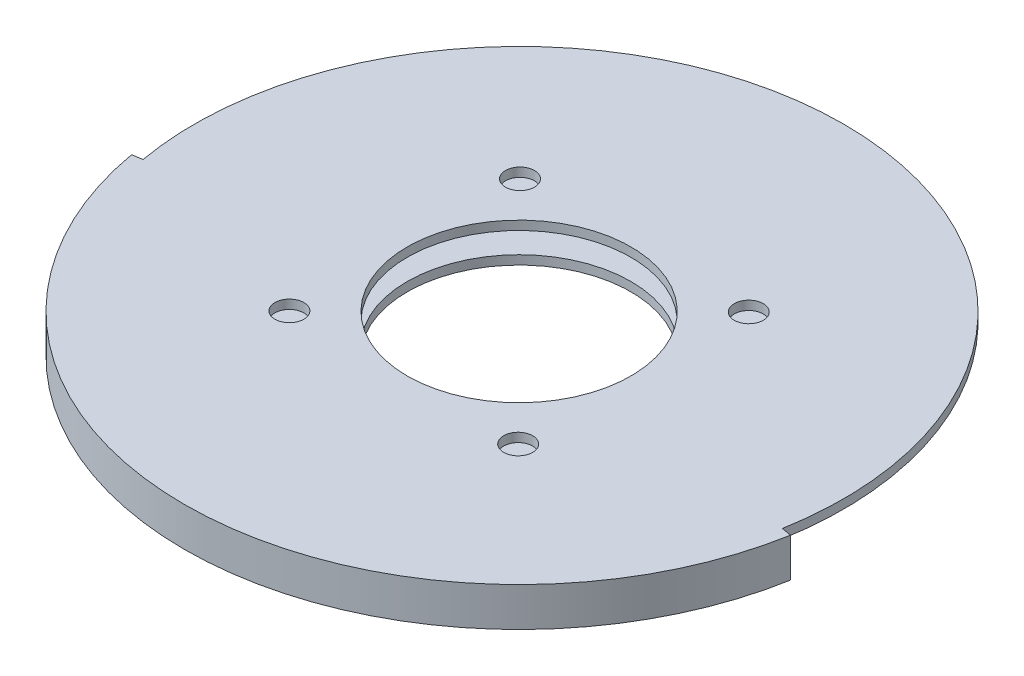
ISO-10303-21;
HEADER;
FILE_DESCRIPTION(('STEP AP214'),'2;1');
FILE_NAME('part.step','',(''),(''),'','','');
FILE_SCHEMA(('AUTOMOTIVE_DESIGN { 1 0 10303 214 1 1 1 1 }'));
ENDSEC;
DATA;
#1=APPLICATION_CONTEXT('core data for automotive mechanical design processes');
#2=APPLICATION_PROTOCOL_DEFINITION('international standard','automotive_design',2000,#1);
#3=PRODUCT_CONTEXT('',#1,'mechanical');
#4=PRODUCT('Part','Part','',(#3));
#5=PRODUCT_RELATED_PRODUCT_CATEGORY('part','',(#4));
#6=PRODUCT_DEFINITION_FORMATION('','',#4);
#7=PRODUCT_DEFINITION_CONTEXT('part definition',#1,'design');
#8=PRODUCT_DEFINITION('design','',#6,#7);
#9=PRODUCT_DEFINITION_SHAPE('','',#8);
#10=(LENGTH_UNIT() NAMED_UNIT(*) SI_UNIT(.MILLI.,.METRE.));
#11=(NAMED_UNIT(*) PLANE_ANGLE_UNIT() SI_UNIT($,.RADIAN.));
#12=(NAMED_UNIT(*) SI_UNIT($,.STERADIAN.) SOLID_ANGLE_UNIT());
#13=UNCERTAINTY_MEASURE_WITH_UNIT(LENGTH_MEASURE(1.E-05),#10,'distance_accuracy_value','');
#14=(GEOMETRIC_REPRESENTATION_CONTEXT(3) GLOBAL_UNCERTAINTY_ASSIGNED_CONTEXT((#13)) GLOBAL_UNIT_ASSIGNED_CONTEXT((#10,
#11,#12)) REPRESENTATION_CONTEXT('',''));
#15=CARTESIAN_POINT('',(0.,0.,0.));
#16=DIRECTION('',(0.,0.,1.));
#17=DIRECTION('',(1.,0.,0.));
#18=AXIS2_PLACEMENT_3D('',#15,#16,#17);
#19=CARTESIAN_POINT('',(0.,474.404389454863,0.));
#20=DIRECTION('',(0.,1.,0.));
#21=DIRECTION('',(0.,0.,1.));
#22=AXIS2_PLACEMENT_3D('',#19,#20,#21);
#23=CYLINDRICAL_SURFACE('',#22,32.5);
#24=CARTESIAN_POINT('',(0.,475.304389454863,0.));
#25=DIRECTION('',(0.,-1.,0.));
#26=DIRECTION('',(0.,0.,-1.));
#27=AXIS2_PLACEMENT_3D('',#24,#25,#26);
#28=CIRCLE('',#27,32.5);
#29=CARTESIAN_POINT('',(32.0062519728968,475.304389454863,5.64356577417526));
#30=VERTEX_POINT('',#29);
#31=CARTESIAN_POINT('',(-32.0062519728968,475.304389454863,5.64356577417501));
#32=VERTEX_POINT('',#31);
#33=EDGE_CURVE('E109',#30,#32,#28,.T.);
#34=ORIENTED_EDGE('',*,*,#33,.T.);
#35=DIRECTION('',(0.,1.,0.));
#36=VECTOR('',#35,1.);
#37=CARTESIAN_POINT('',(-32.0062519728968,474.404389454863,5.643565774175));
#38=LINE('',#37,#36);
#39=CARTESIAN_POINT('',(-32.0062519728968,477.404389454863,5.643565774175));
#40=VERTEX_POINT('',#39);
#41=EDGE_CURVE('E148',#32,#40,#38,.T.);
#42=ORIENTED_EDGE('',*,*,#41,.T.);
#43=CARTESIAN_POINT('',(0.,477.404389454863,0.));
#44=DIRECTION('',(0.,1.,0.));
#45=DIRECTION('',(0.,0.,1.));
#46=AXIS2_PLACEMENT_3D('',#43,#44,#45);
#47=CIRCLE('',#46,32.5);
#48=CARTESIAN_POINT('',(32.0062519728968,477.404389454863,5.64356577417523));
#49=VERTEX_POINT('',#48);
#50=EDGE_CURVE('E147',#40,#49,#47,.T.);
#51=ORIENTED_EDGE('',*,*,#50,.T.);
#52=DIRECTION('',(0.,1.,0.));
#53=VECTOR('',#52,1.);
#54=CARTESIAN_POINT('',(32.0062519728968,474.404389454863,5.64356577417523));
#55=LINE('',#54,#53);
#56=EDGE_CURVE('E150',#30,#49,#55,.T.);
#57=ORIENTED_EDGE('',*,*,#56,.F.);
#58=EDGE_LOOP('',(#34,#42,#51,#57));
#59=FACE_BOUND('',#58,.T.);
#60=ADVANCED_FACE('F41',(#59),#23,.F.);
#61=CARTESIAN_POINT('',(0.,478.304389454863,0.));
#62=DIRECTION('',(0.,-1.,0.));
#63=DIRECTION('',(0.,0.,-1.));
#64=AXIS2_PLACEMENT_3D('',#61,#62,#63);
#65=CYLINDRICAL_SURFACE('',#64,32.5);
#66=CARTESIAN_POINT('',(-32.0062519728968,478.304389454863,5.643565774175));
#67=VERTEX_POINT('',#66);
#68=EDGE_CURVE('E58',#40,#67,#38,.T.);
#69=ORIENTED_EDGE('',*,*,#68,.T.);
#70=CARTESIAN_POINT('',(0.,478.304389454863,0.));
#71=DIRECTION('',(0.,1.,0.));
#72=DIRECTION('',(0.,0.,1.));
#73=AXIS2_PLACEMENT_3D('',#70,#71,#72);
#74=CIRCLE('',#73,32.5);
#75=CARTESIAN_POINT('',(32.0062519728968,478.304389454863,5.64356577417523));
#76=VERTEX_POINT('',#75);
#77=EDGE_CURVE('E11',#76,#67,#74,.T.);
#78=ORIENTED_EDGE('',*,*,#77,.F.);
#79=EDGE_CURVE('E152',#49,#76,#55,.T.);
#80=ORIENTED_EDGE('',*,*,#79,.F.);
#81=EDGE_CURVE('E50',#49,#40,#47,.T.);
#82=ORIENTED_EDGE('',*,*,#81,.T.);
#83=EDGE_LOOP('',(#69,#78,#80,#82));
#84=FACE_BOUND('',#83,.T.);
#85=ADVANCED_FACE('F43',(#84),#65,.T.);
#86=CARTESIAN_POINT('',(0.,478.304389454863,0.));
#87=DIRECTION('',(0.,1.,0.));
#88=DIRECTION('',(0.,0.,1.));
#89=AXIS2_PLACEMENT_3D('',#86,#87,#88);
#90=PLANE('',#89);
#91=CARTESIAN_POINT('',(11.4540717303614,478.304389454863,11.5457455712368));
#92=DIRECTION('',(0.,1.,0.));
#93=DIRECTION('',(0.,0.,1.));
#94=AXIS2_PLACEMENT_3D('',#91,#92,#93);
#95=CIRCLE('',#94,1.45);
#96=CARTESIAN_POINT('',(11.4540717303614,478.304389454863,12.9957455712368));
#97=VERTEX_POINT('',#96);
#98=EDGE_CURVE('E403',#97,#97,#95,.T.);
#99=ORIENTED_EDGE('',*,*,#98,.F.);
#100=EDGE_LOOP('',(#99));
#101=FACE_BOUND('',#100,.T.);
#102=CARTESIAN_POINT('',(-11.5457455712368,478.304389454863,11.4540717303614));
#103=DIRECTION('',(0.,1.,0.));
#104=DIRECTION('',(0.,0.,1.));
#105=AXIS2_PLACEMENT_3D('',#102,#103,#104);
#106=CIRCLE('',#105,1.45);
#107=CARTESIAN_POINT('',(-11.5457455712368,478.304389454863,12.9040717303614));
#108=VERTEX_POINT('',#107);
#109=EDGE_CURVE('E411',#108,#108,#106,.T.);
#110=ORIENTED_EDGE('',*,*,#109,.F.);
#111=EDGE_LOOP('',(#110));
#112=FACE_BOUND('',#111,.T.);
#113=CARTESIAN_POINT('',(0.,478.304389454863,0.));
#114=DIRECTION('',(0.,1.,0.));
#115=DIRECTION('',(0.,0.,1.));
#116=AXIS2_PLACEMENT_3D('',#113,#114,#115);
#117=CIRCLE('',#116,11.2);
#118=CARTESIAN_POINT('',(0.,478.304389454863,11.2));
#119=VERTEX_POINT('',#118);
#120=EDGE_CURVE('E439',#119,#119,#117,.T.);
#121=ORIENTED_EDGE('',*,*,#120,.F.);
#122=EDGE_LOOP('',(#121));
#123=FACE_BOUND('',#122,.T.);
#124=CARTESIAN_POINT('',(-11.4540717303614,478.304389454863,-11.5457455712369));
#125=DIRECTION('',(0.,1.,0.));
#126=DIRECTION('',(0.,0.,1.));
#127=AXIS2_PLACEMENT_3D('',#124,#125,#126);
#128=CIRCLE('',#127,1.45);
#129=CARTESIAN_POINT('',(-11.4540717303614,478.304389454863,-10.0957455712369));
#130=VERTEX_POINT('',#129);
#131=EDGE_CURVE('E422',#130,#130,#128,.T.);
#132=ORIENTED_EDGE('',*,*,#131,.F.);
#133=EDGE_LOOP('',(#132));
#134=FACE_BOUND('',#133,.T.);
#135=CARTESIAN_POINT('',(11.5457455712369,478.304389454863,-11.4540717303614));
#136=DIRECTION('',(0.,1.,0.));
#137=DIRECTION('',(0.,0.,1.));
#138=AXIS2_PLACEMENT_3D('',#135,#136,#137);
#139=CIRCLE('',#138,1.45);
#140=CARTESIAN_POINT('',(11.5457455712369,478.304389454863,-10.0040717303614));
#141=VERTEX_POINT('',#140);
#142=EDGE_CURVE('E405',#141,#141,#139,.T.);
#143=ORIENTED_EDGE('',*,*,#142,.F.);
#144=EDGE_LOOP('',(#143));
#145=FACE_BOUND('',#144,.T.);
#146=ORIENTED_EDGE('',*,*,#77,.T.);
#147=DIRECTION('',(0.984807753012212,0.,-0.17364817766691));
#148=VECTOR('',#147,1.);
#149=CARTESIAN_POINT('',(-32.991059725909,478.304389454863,5.81721395184191));
#150=LINE('',#149,#148);
#151=CARTESIAN_POINT('',(-32.991059725909,478.304389454863,5.81721395184191));
#152=VERTEX_POINT('',#151);
#153=EDGE_CURVE('E136',#152,#67,#150,.T.);
#154=ORIENTED_EDGE('',*,*,#153,.F.);
#155=CARTESIAN_POINT('',(0.,478.304389454863,0.));
#156=DIRECTION('',(0.,1.,0.));
#157=DIRECTION('',(1.,0.,0.));
#158=AXIS2_PLACEMENT_3D('',#155,#156,#157);
#159=CIRCLE('',#158,33.5);
#160=CARTESIAN_POINT('',(32.991059725909,478.304389454863,5.81721395184217));
#161=VERTEX_POINT('',#160);
#162=EDGE_CURVE('E125',#152,#161,#159,.T.);
#163=ORIENTED_EDGE('',*,*,#162,.T.);
#164=DIRECTION('',(0.984807753012207,0.,0.173648177666936));
#165=VECTOR('',#164,1.);
#166=CARTESIAN_POINT('',(32.0062519728968,478.304389454863,5.64356577417523));
#167=LINE('',#166,#165);
#168=EDGE_CURVE('E128',#76,#161,#167,.T.);
#169=ORIENTED_EDGE('',*,*,#168,.F.);
#170=EDGE_LOOP('',(#146,#154,#163,#169));
#171=FACE_BOUND('',#170,.T.);
#172=ADVANCED_FACE('F195',(#101,#112,#123,#134,#145,#171),#90,.T.);
#173=CARTESIAN_POINT('',(0.,477.404389454863,0.));
#174=DIRECTION('',(0.,1.,0.));
#175=DIRECTION('',(0.,0.,1.));
#176=AXIS2_PLACEMENT_3D('',#173,#174,#175);
#177=PLANE('',#176);
#178=CARTESIAN_POINT('',(11.4540717303614,477.404389454863,11.5457455712368));
#179=DIRECTION('',(0.,1.,0.));
#180=DIRECTION('',(0.,0.,1.));
#181=AXIS2_PLACEMENT_3D('',#178,#179,#180);
#182=CIRCLE('',#181,1.45);
#183=CARTESIAN_POINT('',(11.4540717303614,477.404389454863,12.9957455712368));
#184=VERTEX_POINT('',#183);
#185=EDGE_CURVE('E181',#184,#184,#182,.T.);
#186=ORIENTED_EDGE('',*,*,#185,.T.);
#187=EDGE_LOOP('',(#186));
#188=FACE_BOUND('',#187,.T.);
#189=CARTESIAN_POINT('',(-11.5457455712368,477.404389454863,11.4540717303614));
#190=DIRECTION('',(0.,1.,0.));
#191=DIRECTION('',(0.,0.,1.));
#192=AXIS2_PLACEMENT_3D('',#189,#190,#191);
#193=CIRCLE('',#192,1.45);
#194=CARTESIAN_POINT('',(-11.5457455712368,477.404389454863,12.9040717303614));
#195=VERTEX_POINT('',#194);
#196=EDGE_CURVE('E169',#195,#195,#193,.T.);
#197=ORIENTED_EDGE('',*,*,#196,.T.);
#198=EDGE_LOOP('',(#197));
#199=FACE_BOUND('',#198,.T.);
#200=CARTESIAN_POINT('',(0.,477.404389454863,0.));
#201=DIRECTION('',(0.,1.,0.));
#202=DIRECTION('',(0.,0.,1.));
#203=AXIS2_PLACEMENT_3D('',#200,#201,#202);
#204=CIRCLE('',#203,11.2);
#205=CARTESIAN_POINT('',(0.,477.404389454863,11.2));
#206=VERTEX_POINT('',#205);
#207=EDGE_CURVE('E166',#206,#206,#204,.T.);
#208=ORIENTED_EDGE('',*,*,#207,.T.);
#209=EDGE_LOOP('',(#208));
#210=FACE_BOUND('',#209,.T.);
#211=CARTESIAN_POINT('',(-11.4540717303614,477.404389454863,-11.5457455712369));
#212=DIRECTION('',(0.,1.,0.));
#213=DIRECTION('',(0.,0.,1.));
#214=AXIS2_PLACEMENT_3D('',#211,#212,#213);
#215=CIRCLE('',#214,1.45);
#216=CARTESIAN_POINT('',(-11.4540717303614,477.404389454863,-10.0957455712369));
#217=VERTEX_POINT('',#216);
#218=EDGE_CURVE('E163',#217,#217,#215,.T.);
#219=ORIENTED_EDGE('',*,*,#218,.T.);
#220=EDGE_LOOP('',(#219));
#221=FACE_BOUND('',#220,.T.);
#222=CARTESIAN_POINT('',(11.5457455712369,477.404389454863,-11.4540717303614));
#223=DIRECTION('',(0.,1.,0.));
#224=DIRECTION('',(0.,0.,1.));
#225=AXIS2_PLACEMENT_3D('',#222,#223,#224);
#226=CIRCLE('',#225,1.45);
#227=CARTESIAN_POINT('',(11.5457455712369,477.404389454863,-10.0040717303614));
#228=VERTEX_POINT('',#227);
#229=EDGE_CURVE('E158',#228,#228,#226,.T.);
#230=ORIENTED_EDGE('',*,*,#229,.T.);
#231=EDGE_LOOP('',(#230));
#232=FACE_BOUND('',#231,.T.);
#233=ORIENTED_EDGE('',*,*,#81,.F.);
#234=ORIENTED_EDGE('',*,*,#50,.F.);
#235=EDGE_LOOP('',(#233,#234));
#236=FACE_BOUND('',#235,.T.);
#237=ADVANCED_FACE('F202',(#188,#199,#210,#221,#232,#236),#177,.F.);
#238=CARTESIAN_POINT('',(0.,474.404389454863,0.));
#239=DIRECTION('',(0.,1.,0.));
#240=DIRECTION('',(0.,0.,1.));
#241=AXIS2_PLACEMENT_3D('',#238,#239,#240);
#242=CYLINDRICAL_SURFACE('',#241,33.5);
#243=ORIENTED_EDGE('',*,*,#162,.F.);
#244=DIRECTION('',(0.,1.,0.));
#245=VECTOR('',#244,1.);
#246=CARTESIAN_POINT('',(-32.991059725909,474.404389454863,5.81721395184191));
#247=LINE('',#246,#245);
#248=CARTESIAN_POINT('',(-32.991059725909,474.404389454863,5.81721395184191));
#249=VERTEX_POINT('',#248);
#250=EDGE_CURVE('E145',#249,#152,#247,.T.);
#251=ORIENTED_EDGE('',*,*,#250,.F.);
#252=CARTESIAN_POINT('',(0.,474.404389454863,0.));
#253=DIRECTION('',(0.,1.,0.));
#254=DIRECTION('',(1.,0.,0.));
#255=AXIS2_PLACEMENT_3D('',#252,#253,#254);
#256=CIRCLE('',#255,33.5);
#257=CARTESIAN_POINT('',(32.991059725909,474.404389454863,5.81721395184217));
#258=VERTEX_POINT('',#257);
#259=EDGE_CURVE('E133',#249,#258,#256,.T.);
#260=ORIENTED_EDGE('',*,*,#259,.T.);
#261=DIRECTION('',(0.,1.,0.));
#262=VECTOR('',#261,1.);
#263=CARTESIAN_POINT('',(32.991059725909,474.404389454863,5.81721395184217));
#264=LINE('',#263,#262);
#265=EDGE_CURVE('E140',#258,#161,#264,.T.);
#266=ORIENTED_EDGE('',*,*,#265,.T.);
#267=EDGE_LOOP('',(#243,#251,#260,#266));
#268=FACE_BOUND('',#267,.T.);
#269=ADVANCED_FACE('F198',(#268),#242,.T.);
#270=CARTESIAN_POINT('',(-32.991059725909,474.404389454863,5.81721395184191));
#271=DIRECTION('',(0.17364817766691,0.,0.984807753012212));
#272=DIRECTION('',(0.984807753012212,0.,-0.17364817766691));
#273=AXIS2_PLACEMENT_3D('',#270,#271,#272);
#274=PLANE('',#273);
#275=ORIENTED_EDGE('',*,*,#153,.T.);
#276=ORIENTED_EDGE('',*,*,#68,.F.);
#277=ORIENTED_EDGE('',*,*,#41,.F.);
#278=DIRECTION('',(-0.984807753012209,0.,0.173648177666924));
#279=VECTOR('',#278,1.);
#280=CARTESIAN_POINT('',(-28.5594248373541,475.304389454863,5.03579715234078));
#281=LINE('',#280,#279);
#282=CARTESIAN_POINT('',(-28.5594248373541,475.304389454863,5.03579715234078));
#283=VERTEX_POINT('',#282);
#284=EDGE_CURVE('E118',#283,#32,#281,.T.);
#285=ORIENTED_EDGE('',*,*,#284,.F.);
#286=DIRECTION('',(0.,-1.,0.));
#287=VECTOR('',#286,1.);
#288=CARTESIAN_POINT('',(-28.5594248373541,475.304389454863,5.03579715234078));
#289=LINE('',#288,#287);
#290=CARTESIAN_POINT('',(-28.5594248373541,474.404389454863,5.03579715234078));
#291=VERTEX_POINT('',#290);
#292=EDGE_CURVE('E106',#283,#291,#289,.T.);
#293=ORIENTED_EDGE('',*,*,#292,.T.);
#294=DIRECTION('',(0.984807753012212,0.,-0.17364817766691));
#295=VECTOR('',#294,1.);
#296=CARTESIAN_POINT('',(-32.991059725909,474.404389454863,5.81721395184191));
#297=LINE('',#296,#295);
#298=EDGE_CURVE('E138',#249,#291,#297,.T.);
#299=ORIENTED_EDGE('',*,*,#298,.F.);
#300=ORIENTED_EDGE('',*,*,#250,.T.);
#301=EDGE_LOOP('',(#275,#276,#277,#285,#293,#299,#300));
#302=FACE_BOUND('',#301,.T.);
#303=ADVANCED_FACE('F190',(#302),#274,.F.);
#304=CARTESIAN_POINT('',(32.0062519728968,474.404389454863,5.64356577417523));
#305=DIRECTION('',(-0.173648177666936,0.,0.984807753012207));
#306=DIRECTION('',(0.984807753012207,0.,0.173648177666936));
#307=AXIS2_PLACEMENT_3D('',#304,#305,#306);
#308=PLANE('',#307);
#309=ORIENTED_EDGE('',*,*,#168,.T.);
#310=ORIENTED_EDGE('',*,*,#265,.F.);
#311=DIRECTION('',(0.984807753012207,0.,0.173648177666936));
#312=VECTOR('',#311,1.);
#313=CARTESIAN_POINT('',(32.0062519728968,474.404389454863,5.64356577417523));
#314=LINE('',#313,#312);
#315=CARTESIAN_POINT('',(28.559424837354,474.404389454863,5.03579715234101));
#316=VERTEX_POINT('',#315);
#317=EDGE_CURVE('E124',#316,#258,#314,.T.);
#318=ORIENTED_EDGE('',*,*,#317,.F.);
#319=DIRECTION('',(0.,-1.,0.));
#320=VECTOR('',#319,1.);
#321=CARTESIAN_POINT('',(28.559424837354,475.304389454863,5.03579715234101));
#322=LINE('',#321,#320);
#323=CARTESIAN_POINT('',(28.559424837354,475.304389454863,5.03579715234101));
#324=VERTEX_POINT('',#323);
#325=EDGE_CURVE('E103',#324,#316,#322,.T.);
#326=ORIENTED_EDGE('',*,*,#325,.F.);
#327=DIRECTION('',(-0.984807753012208,0.,-0.173648177666931));
#328=VECTOR('',#327,1.);
#329=CARTESIAN_POINT('',(32.0062519728968,475.304389454863,5.64356577417526));
#330=LINE('',#329,#328);
#331=EDGE_CURVE('E113',#30,#324,#330,.T.);
#332=ORIENTED_EDGE('',*,*,#331,.F.);
#333=ORIENTED_EDGE('',*,*,#56,.T.);
#334=ORIENTED_EDGE('',*,*,#79,.T.);
#335=EDGE_LOOP('',(#309,#310,#318,#326,#332,#333,#334));
#336=FACE_BOUND('',#335,.T.);
#337=ADVANCED_FACE('F122',(#336),#308,.F.);
#338=CARTESIAN_POINT('',(0.,474.404389454863,0.));
#339=DIRECTION('',(0.,1.,0.));
#340=DIRECTION('',(1.,0.,0.));
#341=AXIS2_PLACEMENT_3D('',#338,#339,#340);
#342=PLANE('',#341);
#343=CARTESIAN_POINT('',(11.4540717303614,474.404389454863,11.5457455712368));
#344=DIRECTION('',(0.,1.,0.));
#345=DIRECTION('',(0.,0.,1.));
#346=AXIS2_PLACEMENT_3D('',#343,#344,#345);
#347=CIRCLE('',#346,1.45);
#348=CARTESIAN_POINT('',(11.4540717303614,474.404389454863,12.9957455712368));
#349=VERTEX_POINT('',#348);
#350=EDGE_CURVE('E406',#349,#349,#347,.T.);
#351=ORIENTED_EDGE('',*,*,#350,.T.);
#352=EDGE_LOOP('',(#351));
#353=FACE_BOUND('',#352,.T.);
#354=CARTESIAN_POINT('',(-11.5457455712368,474.404389454863,11.4540717303614));
#355=DIRECTION('',(0.,1.,0.));
#356=DIRECTION('',(0.,0.,1.));
#357=AXIS2_PLACEMENT_3D('',#354,#355,#356);
#358=CIRCLE('',#357,1.45);
#359=CARTESIAN_POINT('',(-11.5457455712368,474.404389454863,12.9040717303614));
#360=VERTEX_POINT('',#359);
#361=EDGE_CURVE('E419',#360,#360,#358,.T.);
#362=ORIENTED_EDGE('',*,*,#361,.T.);
#363=EDGE_LOOP('',(#362));
#364=FACE_BOUND('',#363,.T.);
#365=CARTESIAN_POINT('',(0.,474.404389454863,0.));
#366=DIRECTION('',(0.,1.,0.));
#367=DIRECTION('',(0.,0.,1.));
#368=AXIS2_PLACEMENT_3D('',#365,#366,#367);
#369=CIRCLE('',#368,11.2);
#370=CARTESIAN_POINT('',(0.,474.404389454863,11.2));
#371=VERTEX_POINT('',#370);
#372=EDGE_CURVE('E441',#371,#371,#369,.T.);
#373=ORIENTED_EDGE('',*,*,#372,.T.);
#374=EDGE_LOOP('',(#373));
#375=FACE_BOUND('',#374,.T.);
#376=CARTESIAN_POINT('',(-11.4540717303614,474.404389454863,-11.5457455712369));
#377=DIRECTION('',(0.,1.,0.));
#378=DIRECTION('',(0.,0.,1.));
#379=AXIS2_PLACEMENT_3D('',#376,#377,#378);
#380=CIRCLE('',#379,1.45);
#381=CARTESIAN_POINT('',(-11.4540717303614,474.404389454863,-10.0957455712369));
#382=VERTEX_POINT('',#381);
#383=EDGE_CURVE('E414',#382,#382,#380,.T.);
#384=ORIENTED_EDGE('',*,*,#383,.T.);
#385=EDGE_LOOP('',(#384));
#386=FACE_BOUND('',#385,.T.);
#387=CARTESIAN_POINT('',(11.5457455712369,474.404389454863,-11.4540717303614));
#388=DIRECTION('',(0.,1.,0.));
#389=DIRECTION('',(0.,0.,1.));
#390=AXIS2_PLACEMENT_3D('',#387,#388,#389);
#391=CIRCLE('',#390,1.45);
#392=CARTESIAN_POINT('',(11.5457455712369,474.404389454863,-10.0040717303614));
#393=VERTEX_POINT('',#392);
#394=EDGE_CURVE('E159',#393,#393,#391,.T.);
#395=ORIENTED_EDGE('',*,*,#394,.T.);
#396=EDGE_LOOP('',(#395));
#397=FACE_BOUND('',#396,.T.);
#398=ORIENTED_EDGE('',*,*,#259,.F.);
#399=ORIENTED_EDGE('',*,*,#298,.T.);
#400=CARTESIAN_POINT('',(0.,474.404389454863,0.));
#401=DIRECTION('',(0.,-1.,0.));
#402=DIRECTION('',(0.,0.,-1.));
#403=AXIS2_PLACEMENT_3D('',#400,#401,#402);
#404=CIRCLE('',#403,29.);
#405=EDGE_CURVE('E110',#291,#316,#404,.T.);
#406=ORIENTED_EDGE('',*,*,#405,.T.);
#407=ORIENTED_EDGE('',*,*,#317,.T.);
#408=EDGE_LOOP('',(#398,#399,#406,#407));
#409=FACE_BOUND('',#408,.T.);
#410=ADVANCED_FACE('F224',(#353,#364,#375,#386,#397,#409),#342,.F.);
#411=CARTESIAN_POINT('',(0.,475.304389454863,0.));
#412=DIRECTION('',(0.,-1.,0.));
#413=DIRECTION('',(1.,0.,0.));
#414=AXIS2_PLACEMENT_3D('',#411,#412,#413);
#415=PLANE('',#414);
#416=CARTESIAN_POINT('',(11.4540717303614,475.304389454863,11.5457455712368));
#417=DIRECTION('',(0.,-1.,0.));
#418=DIRECTION('',(0.,0.,-1.));
#419=AXIS2_PLACEMENT_3D('',#416,#417,#418);
#420=CIRCLE('',#419,1.45);
#421=CARTESIAN_POINT('',(11.4540717303614,475.304389454863,10.0957455712368));
#422=VERTEX_POINT('',#421);
#423=EDGE_CURVE('E45',#422,#422,#420,.T.);
#424=ORIENTED_EDGE('',*,*,#423,.T.);
#425=EDGE_LOOP('',(#424));
#426=FACE_BOUND('',#425,.T.);
#427=CARTESIAN_POINT('',(-11.5457455712368,475.304389454863,11.4540717303614));
#428=DIRECTION('',(0.,-1.,0.));
#429=DIRECTION('',(0.,0.,-1.));
#430=AXIS2_PLACEMENT_3D('',#427,#428,#429);
#431=CIRCLE('',#430,1.45);
#432=CARTESIAN_POINT('',(-11.5457455712368,475.304389454863,10.0040717303614));
#433=VERTEX_POINT('',#432);
#434=EDGE_CURVE('E167',#433,#433,#431,.T.);
#435=ORIENTED_EDGE('',*,*,#434,.T.);
#436=EDGE_LOOP('',(#435));
#437=FACE_BOUND('',#436,.T.);
#438=CARTESIAN_POINT('',(0.,475.304389454863,0.));
#439=DIRECTION('',(0.,-1.,0.));
#440=DIRECTION('',(0.,0.,-1.));
#441=AXIS2_PLACEMENT_3D('',#438,#439,#440);
#442=CIRCLE('',#441,11.2);
#443=CARTESIAN_POINT('',(0.,475.304389454863,-11.2));
#444=VERTEX_POINT('',#443);
#445=EDGE_CURVE('E164',#444,#444,#442,.T.);
#446=ORIENTED_EDGE('',*,*,#445,.T.);
#447=EDGE_LOOP('',(#446));
#448=FACE_BOUND('',#447,.T.);
#449=CARTESIAN_POINT('',(-11.4540717303614,475.304389454863,-11.5457455712369));
#450=DIRECTION('',(0.,-1.,0.));
#451=DIRECTION('',(0.,0.,-1.));
#452=AXIS2_PLACEMENT_3D('',#449,#450,#451);
#453=CIRCLE('',#452,1.45);
#454=CARTESIAN_POINT('',(-11.4540717303614,475.304389454863,-12.9957455712369));
#455=VERTEX_POINT('',#454);
#456=EDGE_CURVE('E160',#455,#455,#453,.T.);
#457=ORIENTED_EDGE('',*,*,#456,.T.);
#458=EDGE_LOOP('',(#457));
#459=FACE_BOUND('',#458,.T.);
#460=CARTESIAN_POINT('',(11.5457455712369,475.304389454863,-11.4540717303614));
#461=DIRECTION('',(0.,-1.,0.));
#462=DIRECTION('',(0.,0.,-1.));
#463=AXIS2_PLACEMENT_3D('',#460,#461,#462);
#464=CIRCLE('',#463,1.45);
#465=CARTESIAN_POINT('',(11.5457455712369,475.304389454863,-12.9040717303614));
#466=VERTEX_POINT('',#465);
#467=EDGE_CURVE('E155',#466,#466,#464,.T.);
#468=ORIENTED_EDGE('',*,*,#467,.T.);
#469=EDGE_LOOP('',(#468));
#470=FACE_BOUND('',#469,.T.);
#471=ORIENTED_EDGE('',*,*,#33,.F.);
#472=ORIENTED_EDGE('',*,*,#331,.T.);
#473=CARTESIAN_POINT('',(0.,475.304389454863,0.));
#474=DIRECTION('',(0.,-1.,0.));
#475=DIRECTION('',(0.,0.,-1.));
#476=AXIS2_PLACEMENT_3D('',#473,#474,#475);
#477=CIRCLE('',#476,29.);
#478=EDGE_CURVE('E99',#283,#324,#477,.T.);
#479=ORIENTED_EDGE('',*,*,#478,.F.);
#480=ORIENTED_EDGE('',*,*,#284,.T.);
#481=EDGE_LOOP('',(#471,#472,#479,#480));
#482=FACE_BOUND('',#481,.T.);
#483=ADVANCED_FACE('F114',(#426,#437,#448,#459,#470,#482),#415,.F.);
#484=CARTESIAN_POINT('',(0.,475.304389454863,0.));
#485=DIRECTION('',(0.,-1.,0.));
#486=DIRECTION('',(0.,0.,-1.));
#487=AXIS2_PLACEMENT_3D('',#484,#485,#486);
#488=CYLINDRICAL_SURFACE('',#487,29.);
#489=ORIENTED_EDGE('',*,*,#292,.F.);
#490=ORIENTED_EDGE('',*,*,#478,.T.);
#491=ORIENTED_EDGE('',*,*,#325,.T.);
#492=ORIENTED_EDGE('',*,*,#405,.F.);
#493=EDGE_LOOP('',(#489,#490,#491,#492));
#494=FACE_BOUND('',#493,.T.);
#495=ADVANCED_FACE('F101',(#494),#488,.T.);
#496=CARTESIAN_POINT('',(11.5457455712369,474.404389454863,-11.4540717303614));
#497=DIRECTION('',(0.,1.,0.));
#498=DIRECTION('',(0.,0.,1.));
#499=AXIS2_PLACEMENT_3D('',#496,#497,#498);
#500=CYLINDRICAL_SURFACE('',#499,1.45);
#501=ORIENTED_EDGE('',*,*,#394,.F.);
#502=EDGE_LOOP('',(#501));
#503=FACE_BOUND('',#502,.T.);
#504=ORIENTED_EDGE('',*,*,#467,.F.);
#505=EDGE_LOOP('',(#504));
#506=FACE_BOUND('',#505,.T.);
#507=ADVANCED_FACE('F266',(#503,#506),#500,.F.);
#508=CARTESIAN_POINT('',(-11.4540717303614,474.404389454863,-11.5457455712369));
#509=DIRECTION('',(0.,1.,0.));
#510=DIRECTION('',(0.,0.,1.));
#511=AXIS2_PLACEMENT_3D('',#508,#509,#510);
#512=CYLINDRICAL_SURFACE('',#511,1.45);
#513=ORIENTED_EDGE('',*,*,#383,.F.);
#514=EDGE_LOOP('',(#513));
#515=FACE_BOUND('',#514,.T.);
#516=ORIENTED_EDGE('',*,*,#456,.F.);
#517=EDGE_LOOP('',(#516));
#518=FACE_BOUND('',#517,.T.);
#519=ADVANCED_FACE('F271',(#515,#518),#512,.F.);
#520=CARTESIAN_POINT('',(0.,474.404389454863,0.));
#521=DIRECTION('',(0.,1.,0.));
#522=DIRECTION('',(0.,0.,1.));
#523=AXIS2_PLACEMENT_3D('',#520,#521,#522);
#524=CYLINDRICAL_SURFACE('',#523,11.2);
#525=ORIENTED_EDGE('',*,*,#372,.F.);
#526=EDGE_LOOP('',(#525));
#527=FACE_BOUND('',#526,.T.);
#528=ORIENTED_EDGE('',*,*,#445,.F.);
#529=EDGE_LOOP('',(#528));
#530=FACE_BOUND('',#529,.T.);
#531=ADVANCED_FACE('F282',(#527,#530),#524,.F.);
#532=CARTESIAN_POINT('',(-11.5457455712368,474.404389454863,11.4540717303614));
#533=DIRECTION('',(0.,1.,0.));
#534=DIRECTION('',(0.,0.,1.));
#535=AXIS2_PLACEMENT_3D('',#532,#533,#534);
#536=CYLINDRICAL_SURFACE('',#535,1.45);
#537=ORIENTED_EDGE('',*,*,#361,.F.);
#538=EDGE_LOOP('',(#537));
#539=FACE_BOUND('',#538,.T.);
#540=ORIENTED_EDGE('',*,*,#434,.F.);
#541=EDGE_LOOP('',(#540));
#542=FACE_BOUND('',#541,.T.);
#543=ADVANCED_FACE('F293',(#539,#542),#536,.F.);
#544=CARTESIAN_POINT('',(11.4540717303614,474.404389454863,11.5457455712368));
#545=DIRECTION('',(0.,1.,0.));
#546=DIRECTION('',(0.,0.,1.));
#547=AXIS2_PLACEMENT_3D('',#544,#545,#546);
#548=CYLINDRICAL_SURFACE('',#547,1.45);
#549=ORIENTED_EDGE('',*,*,#350,.F.);
#550=EDGE_LOOP('',(#549));
#551=FACE_BOUND('',#550,.T.);
#552=ORIENTED_EDGE('',*,*,#423,.F.);
#553=EDGE_LOOP('',(#552));
#554=FACE_BOUND('',#553,.T.);
#555=ADVANCED_FACE('F304',(#551,#554),#548,.F.);
#556=ORIENTED_EDGE('',*,*,#142,.T.);
#557=EDGE_LOOP('',(#556));
#558=FACE_BOUND('',#557,.T.);
#559=ORIENTED_EDGE('',*,*,#229,.F.);
#560=EDGE_LOOP('',(#559));
#561=FACE_BOUND('',#560,.T.);
#562=ADVANCED_FACE('F274',(#558,#561),#500,.F.);
#563=ORIENTED_EDGE('',*,*,#131,.T.);
#564=EDGE_LOOP('',(#563));
#565=FACE_BOUND('',#564,.T.);
#566=ORIENTED_EDGE('',*,*,#218,.F.);
#567=EDGE_LOOP('',(#566));
#568=FACE_BOUND('',#567,.T.);
#569=ADVANCED_FACE('F285',(#565,#568),#512,.F.);
#570=ORIENTED_EDGE('',*,*,#120,.T.);
#571=EDGE_LOOP('',(#570));
#572=FACE_BOUND('',#571,.T.);
#573=ORIENTED_EDGE('',*,*,#207,.F.);
#574=EDGE_LOOP('',(#573));
#575=FACE_BOUND('',#574,.T.);
#576=ADVANCED_FACE('F296',(#572,#575),#524,.F.);
#577=ORIENTED_EDGE('',*,*,#109,.T.);
#578=EDGE_LOOP('',(#577));
#579=FACE_BOUND('',#578,.T.);
#580=ORIENTED_EDGE('',*,*,#196,.F.);
#581=EDGE_LOOP('',(#580));
#582=FACE_BOUND('',#581,.T.);
#583=ADVANCED_FACE('F307',(#579,#582),#536,.F.);
#584=ORIENTED_EDGE('',*,*,#98,.T.);
#585=EDGE_LOOP('',(#584));
#586=FACE_BOUND('',#585,.T.);
#587=ORIENTED_EDGE('',*,*,#185,.F.);
#588=EDGE_LOOP('',(#587));
#589=FACE_BOUND('',#588,.T.);
#590=ADVANCED_FACE('F317',(#586,#589),#548,.F.);
#591=CLOSED_SHELL('',(#60,#85,#172,#237,#269,#303,#337,#410,#483,#495,#507,#519,#531,#543,#555,
#562,#569,#576,#583,#590));
#592=MANIFOLD_SOLID_BREP('B2',#591);
#593=ADVANCED_BREP_SHAPE_REPRESENTATION('',(#18,#592),#14);
#594=SHAPE_DEFINITION_REPRESENTATION(#9,#593);
ENDSEC;
END-ISO-10303-21;
